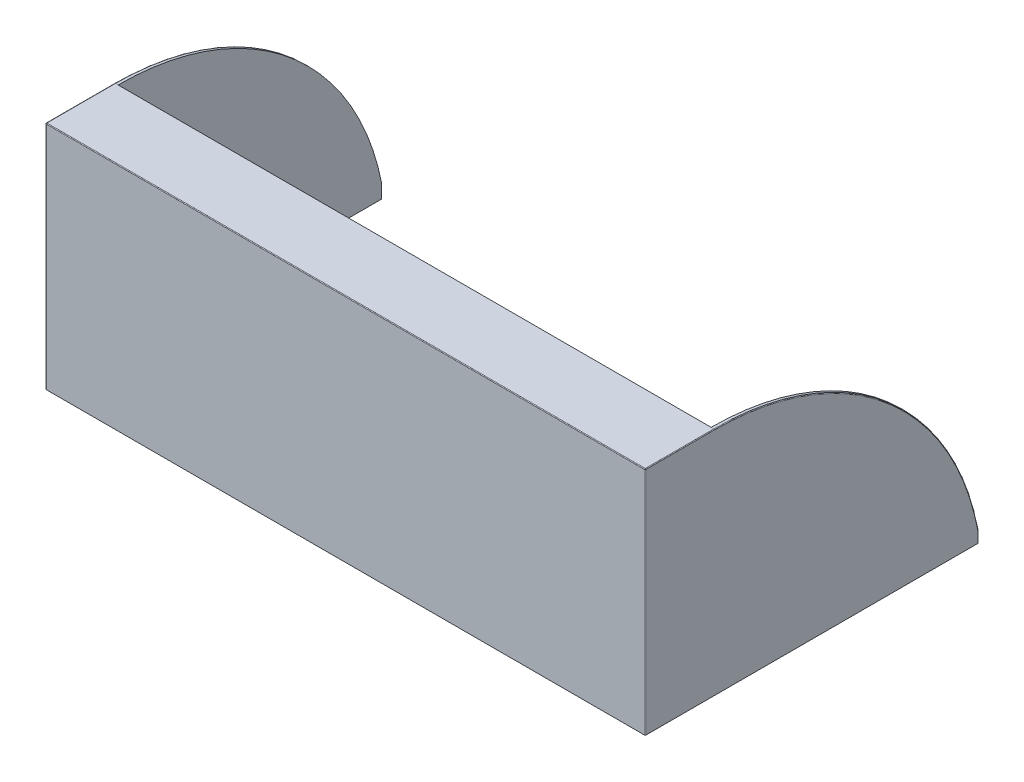
ISO-10303-21;
HEADER;
FILE_DESCRIPTION(('STEP AP214'),'2;1');
FILE_NAME('part.step','',(''),(''),'','','');
FILE_SCHEMA(('AUTOMOTIVE_DESIGN { 1 0 10303 214 1 1 1 1 }'));
ENDSEC;
DATA;
#1=APPLICATION_CONTEXT('core data for automotive mechanical design processes');
#2=APPLICATION_PROTOCOL_DEFINITION('international standard','automotive_design',2000,#1);
#3=PRODUCT_CONTEXT('',#1,'mechanical');
#4=PRODUCT('Part','Part','',(#3));
#5=PRODUCT_RELATED_PRODUCT_CATEGORY('part','',(#4));
#6=PRODUCT_DEFINITION_FORMATION('','',#4);
#7=PRODUCT_DEFINITION_CONTEXT('part definition',#1,'design');
#8=PRODUCT_DEFINITION('design','',#6,#7);
#9=PRODUCT_DEFINITION_SHAPE('','',#8);
#10=(LENGTH_UNIT() NAMED_UNIT(*) SI_UNIT(.MILLI.,.METRE.));
#11=(NAMED_UNIT(*) PLANE_ANGLE_UNIT() SI_UNIT($,.RADIAN.));
#12=(NAMED_UNIT(*) SI_UNIT($,.STERADIAN.) SOLID_ANGLE_UNIT());
#13=UNCERTAINTY_MEASURE_WITH_UNIT(LENGTH_MEASURE(1.E-05),#10,'distance_accuracy_value','');
#14=(GEOMETRIC_REPRESENTATION_CONTEXT(3) GLOBAL_UNCERTAINTY_ASSIGNED_CONTEXT((#13)) GLOBAL_UNIT_ASSIGNED_CONTEXT((#10,
#11,#12)) REPRESENTATION_CONTEXT('',''));
#15=CARTESIAN_POINT('',(0.,0.,0.));
#16=DIRECTION('',(0.,0.,1.));
#17=DIRECTION('',(1.,0.,0.));
#18=AXIS2_PLACEMENT_3D('',#15,#16,#17);
#19=CARTESIAN_POINT('',(-90.,1.,-20.));
#20=DIRECTION('',(0.,0.,-1.));
#21=DIRECTION('',(-1.,0.,0.));
#22=AXIS2_PLACEMENT_3D('',#19,#20,#21);
#23=PLANE('',#22);
#24=DIRECTION('',(1.,0.,0.));
#25=VECTOR('',#24,1.);
#26=CARTESIAN_POINT('',(-90.,0.,-20.));
#27=LINE('',#26,#25);
#28=CARTESIAN_POINT('',(-90.,0.,-20.));
#29=VERTEX_POINT('',#28);
#30=CARTESIAN_POINT('',(90.,0.,-20.));
#31=VERTEX_POINT('',#30);
#32=EDGE_CURVE('E165',#29,#31,#27,.T.);
#33=ORIENTED_EDGE('',*,*,#32,.F.);
#34=DIRECTION('',(0.,-1.,0.));
#35=VECTOR('',#34,1.);
#36=CARTESIAN_POINT('',(-90.,1.,-20.));
#37=LINE('',#36,#35);
#38=CARTESIAN_POINT('',(-90.,1.,-20.));
#39=VERTEX_POINT('',#38);
#40=EDGE_CURVE('E160',#39,#29,#37,.T.);
#41=ORIENTED_EDGE('',*,*,#40,.F.);
#42=DIRECTION('',(1.,0.,0.));
#43=VECTOR('',#42,1.);
#44=CARTESIAN_POINT('',(-90.,1.,-20.));
#45=LINE('',#44,#43);
#46=CARTESIAN_POINT('',(90.,1.,-20.));
#47=VERTEX_POINT('',#46);
#48=EDGE_CURVE('E176',#39,#47,#45,.T.);
#49=ORIENTED_EDGE('',*,*,#48,.T.);
#50=DIRECTION('',(0.,-1.,0.));
#51=VECTOR('',#50,1.);
#52=CARTESIAN_POINT('',(90.,1.,-20.));
#53=LINE('',#52,#51);
#54=EDGE_CURVE('E249',#47,#31,#53,.T.);
#55=ORIENTED_EDGE('',*,*,#54,.T.);
#56=EDGE_LOOP('',(#33,#41,#49,#55));
#57=FACE_BOUND('',#56,.T.);
#58=ADVANCED_FACE('F38',(#57),#23,.T.);
#59=CARTESIAN_POINT('',(0.,1.,0.));
#60=DIRECTION('',(0.,-1.,0.));
#61=DIRECTION('',(0.,0.,-1.));
#62=AXIS2_PLACEMENT_3D('',#59,#60,#61);
#63=PLANE('',#62);
#64=DIRECTION('',(1.,0.,0.));
#65=VECTOR('',#64,1.);
#66=CARTESIAN_POINT('',(-91.,1.,-20.));
#67=LINE('',#66,#65);
#68=CARTESIAN_POINT('',(-90.8,1.,-20.));
#69=VERTEX_POINT('',#68);
#70=EDGE_CURVE('E209',#69,#39,#67,.T.);
#71=ORIENTED_EDGE('',*,*,#70,.F.);
#72=DIRECTION('',(0.,0.,-1.));
#73=VECTOR('',#72,1.);
#74=CARTESIAN_POINT('',(-90.8,1.,1.));
#75=LINE('',#74,#73);
#76=CARTESIAN_POINT('',(-90.8,1.,0.8));
#77=VERTEX_POINT('',#76);
#78=EDGE_CURVE('E11',#69,#77,#75,.F.);
#79=ORIENTED_EDGE('',*,*,#78,.T.);
#80=DIRECTION('',(-1.,0.,0.));
#81=VECTOR('',#80,1.);
#82=CARTESIAN_POINT('',(91.,1.,0.8));
#83=LINE('',#82,#81);
#84=CARTESIAN_POINT('',(90.8,1.,0.8));
#85=VERTEX_POINT('',#84);
#86=EDGE_CURVE('E49',#77,#85,#83,.F.);
#87=ORIENTED_EDGE('',*,*,#86,.T.);
#88=DIRECTION('',(0.,0.,1.));
#89=VECTOR('',#88,1.);
#90=CARTESIAN_POINT('',(90.8,1.,0.));
#91=LINE('',#90,#89);
#92=CARTESIAN_POINT('',(90.8,1.,-20.));
#93=VERTEX_POINT('',#92);
#94=EDGE_CURVE('E337',#85,#93,#91,.F.);
#95=ORIENTED_EDGE('',*,*,#94,.T.);
#96=DIRECTION('',(-1.,0.,0.));
#97=VECTOR('',#96,1.);
#98=CARTESIAN_POINT('',(91.,1.,-20.));
#99=LINE('',#98,#97);
#100=EDGE_CURVE('E221',#93,#47,#99,.T.);
#101=ORIENTED_EDGE('',*,*,#100,.T.);
#102=ORIENTED_EDGE('',*,*,#48,.F.);
#103=EDGE_LOOP('',(#71,#79,#87,#95,#101,#102));
#104=FACE_BOUND('',#103,.T.);
#105=ADVANCED_FACE('F408',(#104),#63,.F.);
#106=CARTESIAN_POINT('',(0.,0.,0.));
#107=DIRECTION('',(0.,-1.,0.));
#108=DIRECTION('',(0.,0.,-1.));
#109=AXIS2_PLACEMENT_3D('',#106,#107,#108);
#110=PLANE('',#109);
#111=DIRECTION('',(0.,0.,-1.));
#112=VECTOR('',#111,1.);
#113=CARTESIAN_POINT('',(-90.,0.,0.));
#114=LINE('',#113,#112);
#115=CARTESIAN_POINT('',(-90.,0.,0.));
#116=VERTEX_POINT('',#115);
#117=EDGE_CURVE('E151',#116,#29,#114,.T.);
#118=ORIENTED_EDGE('',*,*,#117,.T.);
#119=ORIENTED_EDGE('',*,*,#32,.T.);
#120=DIRECTION('',(0.,0.,-1.));
#121=VECTOR('',#120,1.);
#122=CARTESIAN_POINT('',(90.,0.,0.));
#123=LINE('',#122,#121);
#124=CARTESIAN_POINT('',(90.,0.,0.));
#125=VERTEX_POINT('',#124);
#126=EDGE_CURVE('E172',#125,#31,#123,.T.);
#127=ORIENTED_EDGE('',*,*,#126,.F.);
#128=DIRECTION('',(1.,0.,0.));
#129=VECTOR('',#128,1.);
#130=CARTESIAN_POINT('',(-90.,0.,0.));
#131=LINE('',#130,#129);
#132=EDGE_CURVE('E170',#116,#125,#131,.T.);
#133=ORIENTED_EDGE('',*,*,#132,.F.);
#134=EDGE_LOOP('',(#118,#119,#127,#133));
#135=FACE_BOUND('',#134,.T.);
#136=ADVANCED_FACE('F171',(#135),#110,.T.);
#137=CARTESIAN_POINT('',(91.,-69.,0.));
#138=DIRECTION('',(0.,1.,0.));
#139=DIRECTION('',(0.,0.,1.));
#140=AXIS2_PLACEMENT_3D('',#137,#138,#139);
#141=PLANE('',#140);
#142=DIRECTION('',(1.,0.,0.));
#143=VECTOR('',#142,1.);
#144=CARTESIAN_POINT('',(-91.,-69.,1.));
#145=LINE('',#144,#143);
#146=CARTESIAN_POINT('',(-90.8,-69.,1.));
#147=VERTEX_POINT('',#146);
#148=CARTESIAN_POINT('',(90.8,-69.,1.));
#149=VERTEX_POINT('',#148);
#150=EDGE_CURVE('E183',#147,#149,#145,.T.);
#151=ORIENTED_EDGE('',*,*,#150,.F.);
#152=CARTESIAN_POINT('',(-90.8,-69.,0.8));
#153=DIRECTION('',(0.,1.,0.));
#154=DIRECTION('',(0.,0.,1.));
#155=AXIS2_PLACEMENT_3D('',#152,#153,#154);
#156=CIRCLE('',#155,0.2);
#157=CARTESIAN_POINT('',(-91.,-69.,0.8));
#158=VERTEX_POINT('',#157);
#159=EDGE_CURVE('E334',#147,#158,#156,.F.);
#160=ORIENTED_EDGE('',*,*,#159,.T.);
#161=DIRECTION('',(0.,0.,1.));
#162=VECTOR('',#161,1.);
#163=CARTESIAN_POINT('',(-91.,-69.,0.));
#164=LINE('',#163,#162);
#165=CARTESIAN_POINT('',(-91.,-69.,-100.));
#166=VERTEX_POINT('',#165);
#167=EDGE_CURVE('E193',#166,#158,#164,.T.);
#168=ORIENTED_EDGE('',*,*,#167,.F.);
#169=DIRECTION('',(1.,0.,0.));
#170=VECTOR('',#169,1.);
#171=CARTESIAN_POINT('',(-91.,-69.,-100.));
#172=LINE('',#171,#170);
#173=CARTESIAN_POINT('',(-90.,-69.,-100.));
#174=VERTEX_POINT('',#173);
#175=EDGE_CURVE('E202',#166,#174,#172,.T.);
#176=ORIENTED_EDGE('',*,*,#175,.T.);
#177=DIRECTION('',(0.,0.,1.));
#178=VECTOR('',#177,1.);
#179=CARTESIAN_POINT('',(-90.,-69.,0.));
#180=LINE('',#179,#178);
#181=CARTESIAN_POINT('',(-90.,-69.,0.));
#182=VERTEX_POINT('',#181);
#183=EDGE_CURVE('E198',#174,#182,#180,.T.);
#184=ORIENTED_EDGE('',*,*,#183,.T.);
#185=DIRECTION('',(1.,0.,0.));
#186=VECTOR('',#185,1.);
#187=CARTESIAN_POINT('',(-91.,-69.,0.));
#188=LINE('',#187,#186);
#189=CARTESIAN_POINT('',(90.,-69.,0.));
#190=VERTEX_POINT('',#189);
#191=EDGE_CURVE('E180',#182,#190,#188,.T.);
#192=ORIENTED_EDGE('',*,*,#191,.T.);
#193=DIRECTION('',(0.,0.,-1.));
#194=VECTOR('',#193,1.);
#195=CARTESIAN_POINT('',(90.,-69.,0.));
#196=LINE('',#195,#194);
#197=CARTESIAN_POINT('',(90.,-69.,-100.));
#198=VERTEX_POINT('',#197);
#199=EDGE_CURVE('E224',#190,#198,#196,.T.);
#200=ORIENTED_EDGE('',*,*,#199,.T.);
#201=DIRECTION('',(-1.,0.,0.));
#202=VECTOR('',#201,1.);
#203=CARTESIAN_POINT('',(91.,-69.,-100.));
#204=LINE('',#203,#202);
#205=CARTESIAN_POINT('',(91.,-69.,-100.));
#206=VERTEX_POINT('',#205);
#207=EDGE_CURVE('E166',#206,#198,#204,.T.);
#208=ORIENTED_EDGE('',*,*,#207,.F.);
#209=DIRECTION('',(0.,0.,-1.));
#210=VECTOR('',#209,1.);
#211=CARTESIAN_POINT('',(91.,-69.,0.));
#212=LINE('',#211,#210);
#213=CARTESIAN_POINT('',(91.,-69.,0.8));
#214=VERTEX_POINT('',#213);
#215=EDGE_CURVE('E213',#214,#206,#212,.T.);
#216=ORIENTED_EDGE('',*,*,#215,.F.);
#217=CARTESIAN_POINT('',(90.8,-69.,0.8));
#218=DIRECTION('',(0.,1.,0.));
#219=DIRECTION('',(0.,0.,1.));
#220=AXIS2_PLACEMENT_3D('',#217,#218,#219);
#221=CIRCLE('',#220,0.2);
#222=EDGE_CURVE('E331',#214,#149,#221,.F.);
#223=ORIENTED_EDGE('',*,*,#222,.T.);
#224=EDGE_LOOP('',(#151,#160,#168,#176,#184,#192,#200,#208,#216,#223));
#225=FACE_BOUND('',#224,.T.);
#226=ADVANCED_FACE('F308',(#225),#141,.F.);
#227=CARTESIAN_POINT('',(91.,-69.,-100.));
#228=DIRECTION('',(0.,0.,1.));
#229=DIRECTION('',(1.,0.,0.));
#230=AXIS2_PLACEMENT_3D('',#227,#228,#229);
#231=PLANE('',#230);
#232=DIRECTION('',(-1.,0.,0.));
#233=VECTOR('',#232,1.);
#234=CARTESIAN_POINT('',(91.,-64.8928482707894,-100.));
#235=LINE('',#234,#233);
#236=CARTESIAN_POINT('',(90.8,-64.8928482707894,-100.));
#237=VERTEX_POINT('',#236);
#238=CARTESIAN_POINT('',(90.,-64.8928482707894,-100.));
#239=VERTEX_POINT('',#238);
#240=EDGE_CURVE('E236',#237,#239,#235,.T.);
#241=ORIENTED_EDGE('',*,*,#240,.F.);
#242=CARTESIAN_POINT('',(90.8,-64.8928482707894,-100.));
#243=CARTESIAN_POINT('',(90.8023758316902,-64.8928412719718,-100.));
#244=CARTESIAN_POINT('',(90.8047420120212,-64.8930689184265,-100.));
#245=CARTESIAN_POINT('',(90.8093692262902,-64.8939271343331,-100.));
#246=CARTESIAN_POINT('',(90.8116312364357,-64.894552340183,-100.));
#247=CARTESIAN_POINT('',(90.8167041362082,-64.8963860826479,-100.));
#248=CARTESIAN_POINT('',(90.8194707140167,-64.897714687656,-100.));
#249=CARTESIAN_POINT('',(90.8247706944289,-64.9007931890213,-100.));
#250=CARTESIAN_POINT('',(90.8273025952241,-64.9025455701055,-100.));
#251=CARTESIAN_POINT('',(90.8340476416876,-64.9078365333926,-100.));
#252=CARTESIAN_POINT('',(90.8380081819196,-64.9116922866512,-100.));
#253=CARTESIAN_POINT('',(90.8453687527471,-64.9198935921124,-100.));
#254=CARTESIAN_POINT('',(90.848767490103,-64.9242402366777,-100.));
#255=CARTESIAN_POINT('',(90.8570926101521,-64.9359510860998,-100.));
#256=CARTESIAN_POINT('',(90.8616928710426,-64.9435444407459,-100.));
#257=CARTESIAN_POINT('',(90.8701988629481,-64.9591162190174,-100.));
#258=CARTESIAN_POINT('',(90.8741028434772,-64.9670955507947,-100.));
#259=CARTESIAN_POINT('',(90.8851107427775,-64.991444236167,-100.));
#260=CARTESIAN_POINT('',(90.8914649690109,-65.0081491483521,-100.));
#261=CARTESIAN_POINT('',(90.9036892802995,-65.0439693029047,-100.));
#262=CARTESIAN_POINT('',(90.9094090301782,-65.063132645802,-100.));
#263=CARTESIAN_POINT('',(90.9198560633837,-65.1017322429305,-100.));
#264=CARTESIAN_POINT('',(90.9245829677657,-65.1211685983552,-100.));
#265=CARTESIAN_POINT('',(90.9377075484216,-65.1798093014369,-100.));
#266=CARTESIAN_POINT('',(90.9450211075876,-65.2192527477413,-100.));
#267=CARTESIAN_POINT('',(90.9578092355502,-65.2984603361936,-100.));
#268=CARTESIAN_POINT('',(90.9632818986962,-65.3382247672944,-100.));
#269=CARTESIAN_POINT('',(90.9728317101254,-65.4178662047621,-100.));
#270=CARTESIAN_POINT('',(90.9769106781084,-65.4577429952637,-100.));
#271=CARTESIAN_POINT('',(90.983930983144,-65.537354336889,-100.));
#272=CARTESIAN_POINT('',(90.9868789608967,-65.5770883176463,-100.));
#273=CARTESIAN_POINT('',(90.9918287799752,-65.6566329940915,-100.));
#274=CARTESIAN_POINT('',(90.9938301793782,-65.6964437169162,-100.));
#275=CARTESIAN_POINT('',(90.9969684373727,-65.7756752020309,-100.));
#276=CARTESIAN_POINT('',(90.9981142487959,-65.8150956172609,-100.));
#277=CARTESIAN_POINT('',(90.9996273071879,-65.893927740204,-100.));
#278=CARTESIAN_POINT('',(90.9999950239513,-65.9333394387972,-100.));
#279=CARTESIAN_POINT('',(91.,-65.9727501631906,-100.));
#280=B_SPLINE_CURVE_WITH_KNOTS('',3,(#242,#243,#244,#245,#246,#247,#248,#249,#250,#251,#252,
#253,#254,#255,#256,#257,#258,#259,#260,#261,#262,#263,#264,#265,#266,#267,#268,#269,#270,#271,
#272,#273,#274,#275,#276,#277,#278,#279),.UNSPECIFIED.,.F.,.F.,(4,2,2,2,2,2,2,2,2,2,2,2,2,2,2,2,
2,2,4),(0.,0.00710105776747363,0.0141082886157392,0.0232636125460189,0.0324739770362471,
0.0489630291419828,0.0654895249202987,0.092054857370974,0.118686062897145,0.172210123115982,
0.232176691608029,0.292166106455486,0.412434090924712,0.532826193477361,0.653060498087997,
0.772577619811276,0.892150484736433,1.01045390258576,1.12868587130505),.UNSPECIFIED.);
#281=CARTESIAN_POINT('',(91.,-65.9727501631906,-100.));
#282=VERTEX_POINT('',#281);
#283=EDGE_CURVE('E312',#237,#282,#280,.T.);
#284=ORIENTED_EDGE('',*,*,#283,.T.);
#285=DIRECTION('',(0.,1.,0.));
#286=VECTOR('',#285,1.);
#287=CARTESIAN_POINT('',(91.,-69.,-100.));
#288=LINE('',#287,#286);
#289=EDGE_CURVE('E216',#206,#282,#288,.T.);
#290=ORIENTED_EDGE('',*,*,#289,.F.);
#291=ORIENTED_EDGE('',*,*,#207,.T.);
#292=DIRECTION('',(0.,1.,0.));
#293=VECTOR('',#292,1.);
#294=CARTESIAN_POINT('',(90.,-69.,-100.));
#295=LINE('',#294,#293);
#296=EDGE_CURVE('E227',#198,#239,#295,.T.);
#297=ORIENTED_EDGE('',*,*,#296,.T.);
#298=EDGE_LOOP('',(#241,#284,#290,#291,#297));
#299=FACE_BOUND('',#298,.T.);
#300=ADVANCED_FACE('F303',(#299),#231,.F.);
#301=CARTESIAN_POINT('',(91.,-80.5101163110534,-20.));
#302=DIRECTION('',(-1.,0.,0.));
#303=DIRECTION('',(0.,0.,1.));
#304=AXIS2_PLACEMENT_3D('',#301,#302,#303);
#305=CYLINDRICAL_SURFACE('',#304,81.5101163110534);
#306=ORIENTED_EDGE('',*,*,#100,.F.);
#307=CARTESIAN_POINT('',(90.8,-80.5101163110534,-20.));
#308=DIRECTION('',(-1.,0.,0.));
#309=DIRECTION('',(0.,0.,1.));
#310=AXIS2_PLACEMENT_3D('',#307,#308,#309);
#311=CIRCLE('',#310,81.5101163110534);
#312=EDGE_CURVE('E321',#93,#237,#311,.T.);
#313=ORIENTED_EDGE('',*,*,#312,.T.);
#314=ORIENTED_EDGE('',*,*,#240,.T.);
#315=CARTESIAN_POINT('',(90.,-80.5101163110534,-20.));
#316=DIRECTION('',(1.,0.,0.));
#317=DIRECTION('',(0.,0.,1.));
#318=AXIS2_PLACEMENT_3D('',#315,#316,#317);
#319=CIRCLE('',#318,81.5101163110534);
#320=EDGE_CURVE('E217',#239,#47,#319,.T.);
#321=ORIENTED_EDGE('',*,*,#320,.T.);
#322=EDGE_LOOP('',(#306,#313,#314,#321));
#323=FACE_BOUND('',#322,.T.);
#324=ADVANCED_FACE('F296',(#323),#305,.T.);
#325=CARTESIAN_POINT('',(91.,-80.5101163110534,-20.));
#326=DIRECTION('',(-1.,0.,0.));
#327=DIRECTION('',(0.,0.,1.));
#328=AXIS2_PLACEMENT_3D('',#325,#326,#327);
#329=PLANE('',#328);
#330=ORIENTED_EDGE('',*,*,#289,.T.);
#331=CARTESIAN_POINT('',(91.,-80.5101163110534,-20.));
#332=DIRECTION('',(-1.,0.,0.));
#333=DIRECTION('',(0.,0.,1.));
#334=AXIS2_PLACEMENT_3D('',#331,#332,#333);
#335=CIRCLE('',#334,81.3101163110534);
#336=CARTESIAN_POINT('',(91.,0.799999999999995,-20.));
#337=VERTEX_POINT('',#336);
#338=EDGE_CURVE('E421',#282,#337,#335,.F.);
#339=ORIENTED_EDGE('',*,*,#338,.T.);
#340=DIRECTION('',(0.,0.,1.));
#341=VECTOR('',#340,1.);
#342=CARTESIAN_POINT('',(91.,0.799999999999995,-20.));
#343=LINE('',#342,#341);
#344=CARTESIAN_POINT('',(91.,0.799999999999995,0.8));
#345=VERTEX_POINT('',#344);
#346=EDGE_CURVE('E427',#337,#345,#343,.T.);
#347=ORIENTED_EDGE('',*,*,#346,.T.);
#348=DIRECTION('',(0.,1.,0.));
#349=VECTOR('',#348,1.);
#350=CARTESIAN_POINT('',(91.,-69.,0.8));
#351=LINE('',#350,#349);
#352=EDGE_CURVE('E424',#345,#214,#351,.F.);
#353=ORIENTED_EDGE('',*,*,#352,.T.);
#354=ORIENTED_EDGE('',*,*,#215,.T.);
#355=EDGE_LOOP('',(#330,#339,#347,#353,#354));
#356=FACE_BOUND('',#355,.T.);
#357=ADVANCED_FACE('F292',(#356),#329,.F.);
#358=CARTESIAN_POINT('',(90.,-80.5101163110534,-20.));
#359=DIRECTION('',(-1.,0.,0.));
#360=DIRECTION('',(0.,0.,1.));
#361=AXIS2_PLACEMENT_3D('',#358,#359,#360);
#362=PLANE('',#361);
#363=DIRECTION('',(0.,-1.,0.));
#364=VECTOR('',#363,1.);
#365=CARTESIAN_POINT('',(90.,1.,0.));
#366=LINE('',#365,#364);
#367=EDGE_CURVE('E212',#125,#190,#366,.T.);
#368=ORIENTED_EDGE('',*,*,#367,.F.);
#369=ORIENTED_EDGE('',*,*,#126,.T.);
#370=ORIENTED_EDGE('',*,*,#54,.F.);
#371=ORIENTED_EDGE('',*,*,#320,.F.);
#372=ORIENTED_EDGE('',*,*,#296,.F.);
#373=ORIENTED_EDGE('',*,*,#199,.F.);
#374=EDGE_LOOP('',(#368,#369,#370,#371,#372,#373));
#375=FACE_BOUND('',#374,.T.);
#376=ADVANCED_FACE('F295',(#375),#362,.T.);
#377=CARTESIAN_POINT('',(-90.,-80.5101163110534,-20.));
#378=DIRECTION('',(-1.,0.,0.));
#379=DIRECTION('',(0.,0.,1.));
#380=AXIS2_PLACEMENT_3D('',#377,#378,#379);
#381=PLANE('',#380);
#382=ORIENTED_EDGE('',*,*,#117,.F.);
#383=DIRECTION('',(0.,1.,0.));
#384=VECTOR('',#383,1.);
#385=CARTESIAN_POINT('',(-90.,1.,0.));
#386=LINE('',#385,#384);
#387=EDGE_CURVE('E156',#182,#116,#386,.T.);
#388=ORIENTED_EDGE('',*,*,#387,.F.);
#389=ORIENTED_EDGE('',*,*,#183,.F.);
#390=DIRECTION('',(0.,-1.,0.));
#391=VECTOR('',#390,1.);
#392=CARTESIAN_POINT('',(-90.,-69.,-100.));
#393=LINE('',#392,#391);
#394=CARTESIAN_POINT('',(-90.,-64.8928482707894,-100.));
#395=VERTEX_POINT('',#394);
#396=EDGE_CURVE('E188',#395,#174,#393,.T.);
#397=ORIENTED_EDGE('',*,*,#396,.F.);
#398=CARTESIAN_POINT('',(-90.,-80.5101163110534,-20.));
#399=DIRECTION('',(-1.,0.,0.));
#400=DIRECTION('',(0.,0.,1.));
#401=AXIS2_PLACEMENT_3D('',#398,#399,#400);
#402=CIRCLE('',#401,81.5101163110534);
#403=EDGE_CURVE('E182',#39,#395,#402,.T.);
#404=ORIENTED_EDGE('',*,*,#403,.F.);
#405=ORIENTED_EDGE('',*,*,#40,.T.);
#406=EDGE_LOOP('',(#382,#388,#389,#397,#404,#405));
#407=FACE_BOUND('',#406,.T.);
#408=ADVANCED_FACE('F153',(#407),#381,.F.);
#409=CARTESIAN_POINT('',(-91.,-80.5101163110534,-20.));
#410=DIRECTION('',(1.,0.,0.));
#411=DIRECTION('',(0.,0.,-1.));
#412=AXIS2_PLACEMENT_3D('',#409,#410,#411);
#413=CYLINDRICAL_SURFACE('',#412,81.5101163110534);
#414=DIRECTION('',(1.,0.,0.));
#415=VECTOR('',#414,1.);
#416=CARTESIAN_POINT('',(-91.,-64.8928482707894,-100.));
#417=LINE('',#416,#415);
#418=CARTESIAN_POINT('',(-90.8,-64.8928482707894,-100.));
#419=VERTEX_POINT('',#418);
#420=EDGE_CURVE('E206',#419,#395,#417,.T.);
#421=ORIENTED_EDGE('',*,*,#420,.F.);
#422=CARTESIAN_POINT('',(-90.8,-80.5101163110534,-20.));
#423=DIRECTION('',(-1.,0.,0.));
#424=DIRECTION('',(0.,0.,1.));
#425=AXIS2_PLACEMENT_3D('',#422,#423,#424);
#426=CIRCLE('',#425,81.5101163110534);
#427=EDGE_CURVE('E274',#419,#69,#426,.F.);
#428=ORIENTED_EDGE('',*,*,#427,.T.);
#429=ORIENTED_EDGE('',*,*,#70,.T.);
#430=ORIENTED_EDGE('',*,*,#403,.T.);
#431=EDGE_LOOP('',(#421,#428,#429,#430));
#432=FACE_BOUND('',#431,.T.);
#433=ADVANCED_FACE('F286',(#432),#413,.T.);
#434=CARTESIAN_POINT('',(-91.,-69.,-100.));
#435=DIRECTION('',(0.,0.,1.));
#436=DIRECTION('',(1.,0.,0.));
#437=AXIS2_PLACEMENT_3D('',#434,#435,#436);
#438=PLANE('',#437);
#439=DIRECTION('',(0.,-1.,0.));
#440=VECTOR('',#439,1.);
#441=CARTESIAN_POINT('',(-91.,-69.,-100.));
#442=LINE('',#441,#440);
#443=CARTESIAN_POINT('',(-91.,-65.9727501631906,-100.));
#444=VERTEX_POINT('',#443);
#445=EDGE_CURVE('E201',#444,#166,#442,.T.);
#446=ORIENTED_EDGE('',*,*,#445,.F.);
#447=CARTESIAN_POINT('',(-91.,-65.9727501631906,-100.));
#448=CARTESIAN_POINT('',(-90.9999987608847,-65.939401214846,-100.));
#449=CARTESIAN_POINT('',(-90.9997338568929,-65.9060532233295,-100.));
#450=CARTESIAN_POINT('',(-90.9986525960738,-65.8393630875575,-100.));
#451=CARTESIAN_POINT('',(-90.997836186997,-65.8060209441554,-100.));
#452=CARTESIAN_POINT('',(-90.9945225157889,-65.7059864652773,-100.));
#453=CARTESIAN_POINT('',(-90.991160764036,-65.6393183160146,-100.));
#454=CARTESIAN_POINT('',(-90.9836852864639,-65.5345825001477,-100.));
#455=CARTESIAN_POINT('',(-90.9805042866027,-65.4964477103562,-100.));
#456=CARTESIAN_POINT('',(-90.9730515917548,-65.4202893222375,-100.));
#457=CARTESIAN_POINT('',(-90.9687800324271,-65.382265710675,-100.));
#458=CARTESIAN_POINT('',(-90.9570976306579,-65.2925618801717,-100.));
#459=CARTESIAN_POINT('',(-90.9491100477176,-65.2409515517214,-100.));
#460=CARTESIAN_POINT('',(-90.9323495855032,-65.1545971988612,-100.));
#461=CARTESIAN_POINT('',(-90.9246164934108,-65.1196609225324,-100.));
#462=CARTESIAN_POINT('',(-90.9089737821765,-65.0613107462751,-100.));
#463=CARTESIAN_POINT('',(-90.9018654884315,-65.0376893348814,-100.));
#464=CARTESIAN_POINT('',(-90.8877302862457,-64.9983327445115,-100.));
#465=CARTESIAN_POINT('',(-90.8813364107228,-64.9823844518559,-100.));
#466=CARTESIAN_POINT('',(-90.8700380897579,-64.9588427710386,-100.));
#467=CARTESIAN_POINT('',(-90.8658795460307,-64.9508951259465,-100.));
#468=CARTESIAN_POINT('',(-90.8567507353269,-64.9354879317446,-100.));
#469=CARTESIAN_POINT('',(-90.8517836715664,-64.9280266129543,-100.));
#470=CARTESIAN_POINT('',(-90.8438994185254,-64.9182531399275,-100.));
#471=CARTESIAN_POINT('',(-90.8415166936627,-64.915514551391,-100.));
#472=CARTESIAN_POINT('',(-90.8364792263253,-64.9102794657274,-100.));
#473=CARTESIAN_POINT('',(-90.8338237287245,-64.9077836800369,-100.));
#474=CARTESIAN_POINT('',(-90.8281470121975,-64.9031295585127,-100.));
#475=CARTESIAN_POINT('',(-90.825120280394,-64.9009777776305,-100.));
#476=CARTESIAN_POINT('',(-90.818721923562,-64.897299181549,-100.));
#477=CARTESIAN_POINT('',(-90.8153535096287,-64.8957671194732,-100.));
#478=CARTESIAN_POINT('',(-90.8099413941693,-64.8940912126313,-100.));
#479=CARTESIAN_POINT('',(-90.8079950435749,-64.8936329173234,-100.));
#480=CARTESIAN_POINT('',(-90.8040344867139,-64.8930079287126,-100.));
#481=CARTESIAN_POINT('',(-90.8020197662349,-64.8928445387799,-100.));
#482=CARTESIAN_POINT('',(-90.8000000000051,-64.8928482707731,-100.));
#483=B_SPLINE_CURVE_WITH_KNOTS('',3,(#447,#448,#449,#450,#451,#452,#453,#454,#455,#456,#457,
#458,#459,#460,#461,#462,#463,#464,#465,#466,#467,#468,#469,#470,#471,#472,#473,#474,#475,#476,
#477,#478,#479,#480,#481,#482),.UNSPECIFIED.,.F.,.F.,(4,2,2,2,2,2,2,2,2,2,2,2,2,2,2,2,2,4),(0.,
0.100043680888842,0.200096841236956,0.400299822382401,0.515088645571444,0.629863196688221,
0.786439560630167,0.893698382553134,0.967632570116824,1.01907588025381,1.04596324620127,
1.07274657190122,1.08362386484764,1.09453212565787,1.10562832960309,1.1166285150417,
1.12260629414707,1.12865062708297),.UNSPECIFIED.);
#484=EDGE_CURVE('E265',#444,#419,#483,.T.);
#485=ORIENTED_EDGE('',*,*,#484,.T.);
#486=ORIENTED_EDGE('',*,*,#420,.T.);
#487=ORIENTED_EDGE('',*,*,#396,.T.);
#488=ORIENTED_EDGE('',*,*,#175,.F.);
#489=EDGE_LOOP('',(#446,#485,#486,#487,#488));
#490=FACE_BOUND('',#489,.T.);
#491=ADVANCED_FACE('F280',(#490),#438,.F.);
#492=CARTESIAN_POINT('',(-91.,-80.5101163110534,-20.));
#493=DIRECTION('',(-1.,0.,0.));
#494=DIRECTION('',(0.,0.,1.));
#495=AXIS2_PLACEMENT_3D('',#492,#493,#494);
#496=PLANE('',#495);
#497=DIRECTION('',(0.,0.,-1.));
#498=VECTOR('',#497,1.);
#499=CARTESIAN_POINT('',(-91.,0.799999999999995,-20.));
#500=LINE('',#499,#498);
#501=CARTESIAN_POINT('',(-91.,0.799999999999995,0.8));
#502=VERTEX_POINT('',#501);
#503=CARTESIAN_POINT('',(-91.,0.799999999999995,-20.));
#504=VERTEX_POINT('',#503);
#505=EDGE_CURVE('E253',#502,#504,#500,.T.);
#506=ORIENTED_EDGE('',*,*,#505,.T.);
#507=CARTESIAN_POINT('',(-91.,-80.5101163110534,-20.));
#508=DIRECTION('',(-1.,0.,0.));
#509=DIRECTION('',(0.,0.,1.));
#510=AXIS2_PLACEMENT_3D('',#507,#508,#509);
#511=CIRCLE('',#510,81.3101163110534);
#512=EDGE_CURVE('E261',#504,#444,#511,.T.);
#513=ORIENTED_EDGE('',*,*,#512,.T.);
#514=ORIENTED_EDGE('',*,*,#445,.T.);
#515=ORIENTED_EDGE('',*,*,#167,.T.);
#516=DIRECTION('',(0.,-1.,0.));
#517=VECTOR('',#516,1.);
#518=CARTESIAN_POINT('',(-91.,-80.5101163110534,0.799999999999999));
#519=LINE('',#518,#517);
#520=EDGE_CURVE('E258',#158,#502,#519,.F.);
#521=ORIENTED_EDGE('',*,*,#520,.T.);
#522=EDGE_LOOP('',(#506,#513,#514,#515,#521));
#523=FACE_BOUND('',#522,.T.);
#524=ADVANCED_FACE('F285',(#523),#496,.T.);
#525=CARTESIAN_POINT('',(0.,0.,0.));
#526=DIRECTION('',(0.,0.,1.));
#527=DIRECTION('',(1.,0.,0.));
#528=AXIS2_PLACEMENT_3D('',#525,#526,#527);
#529=PLANE('',#528);
#530=ORIENTED_EDGE('',*,*,#132,.T.);
#531=ORIENTED_EDGE('',*,*,#367,.T.);
#532=ORIENTED_EDGE('',*,*,#191,.F.);
#533=ORIENTED_EDGE('',*,*,#387,.T.);
#534=EDGE_LOOP('',(#530,#531,#532,#533));
#535=FACE_BOUND('',#534,.T.);
#536=ADVANCED_FACE('F178',(#535),#529,.F.);
#537=CARTESIAN_POINT('',(0.,0.,1.));
#538=DIRECTION('',(0.,0.,1.));
#539=DIRECTION('',(1.,0.,0.));
#540=AXIS2_PLACEMENT_3D('',#537,#538,#539);
#541=PLANE('',#540);
#542=DIRECTION('',(-1.,0.,0.));
#543=VECTOR('',#542,1.);
#544=CARTESIAN_POINT('',(-91.,0.8,1.));
#545=LINE('',#544,#543);
#546=CARTESIAN_POINT('',(90.8,0.8,1.));
#547=VERTEX_POINT('',#546);
#548=CARTESIAN_POINT('',(-90.8,0.8,1.));
#549=VERTEX_POINT('',#548);
#550=EDGE_CURVE('E320',#547,#549,#545,.T.);
#551=ORIENTED_EDGE('',*,*,#550,.T.);
#552=DIRECTION('',(0.,-1.,0.));
#553=VECTOR('',#552,1.);
#554=CARTESIAN_POINT('',(-90.8,0.,1.));
#555=LINE('',#554,#553);
#556=EDGE_CURVE('E328',#549,#147,#555,.T.);
#557=ORIENTED_EDGE('',*,*,#556,.T.);
#558=ORIENTED_EDGE('',*,*,#150,.T.);
#559=DIRECTION('',(0.,1.,0.));
#560=VECTOR('',#559,1.);
#561=CARTESIAN_POINT('',(90.8,1.,1.));
#562=LINE('',#561,#560);
#563=EDGE_CURVE('E325',#149,#547,#562,.T.);
#564=ORIENTED_EDGE('',*,*,#563,.T.);
#565=EDGE_LOOP('',(#551,#557,#558,#564));
#566=FACE_BOUND('',#565,.T.);
#567=ADVANCED_FACE('F442',(#566),#541,.T.);
#568=CARTESIAN_POINT('',(90.8,-80.5101163110534,-20.));
#569=DIRECTION('',(-1.,0.,0.));
#570=DIRECTION('',(0.,0.,1.));
#571=AXIS2_PLACEMENT_3D('',#568,#569,#570);
#572=TOROIDAL_SURFACE('',#571,81.3101163110534,0.2);
#573=ORIENTED_EDGE('',*,*,#283,.F.);
#574=ORIENTED_EDGE('',*,*,#312,.F.);
#575=CARTESIAN_POINT('',(90.8,0.800000000000001,-20.));
#576=DIRECTION('',(0.,0.,1.));
#577=DIRECTION('',(1.,0.,0.));
#578=AXIS2_PLACEMENT_3D('',#575,#576,#577);
#579=CIRCLE('',#578,0.2);
#580=EDGE_CURVE('E43',#337,#93,#579,.T.);
#581=ORIENTED_EDGE('',*,*,#580,.F.);
#582=ORIENTED_EDGE('',*,*,#338,.F.);
#583=EDGE_LOOP('',(#573,#574,#581,#582));
#584=FACE_BOUND('',#583,.T.);
#585=ADVANCED_FACE('F40',(#584),#572,.T.);
#586=CARTESIAN_POINT('',(90.8,0.799999999999995,-20.));
#587=DIRECTION('',(0.,0.,1.));
#588=DIRECTION('',(1.,0.,0.));
#589=AXIS2_PLACEMENT_3D('',#586,#587,#588);
#590=CYLINDRICAL_SURFACE('',#589,0.2);
#591=ORIENTED_EDGE('',*,*,#580,.T.);
#592=ORIENTED_EDGE('',*,*,#94,.F.);
#593=CARTESIAN_POINT('',(90.8,0.799999999999995,0.8));
#594=DIRECTION('',(0.,0.,1.));
#595=DIRECTION('',(1.,0.,0.));
#596=AXIS2_PLACEMENT_3D('',#593,#594,#595);
#597=CIRCLE('',#596,0.2);
#598=EDGE_CURVE('E365',#345,#85,#597,.T.);
#599=ORIENTED_EDGE('',*,*,#598,.F.);
#600=ORIENTED_EDGE('',*,*,#346,.F.);
#601=EDGE_LOOP('',(#591,#592,#599,#600));
#602=FACE_BOUND('',#601,.T.);
#603=ADVANCED_FACE('F436',(#602),#590,.T.);
#604=CARTESIAN_POINT('',(90.8,0.,0.8));
#605=DIRECTION('',(0.,-1.,0.));
#606=DIRECTION('',(0.,0.,-1.));
#607=AXIS2_PLACEMENT_3D('',#604,#605,#606);
#608=CYLINDRICAL_SURFACE('',#607,0.2);
#609=ORIENTED_EDGE('',*,*,#222,.F.);
#610=ORIENTED_EDGE('',*,*,#352,.F.);
#611=CARTESIAN_POINT('',(90.8,0.8,0.8));
#612=DIRECTION('',(0.,1.,0.));
#613=DIRECTION('',(-1.,0.,0.));
#614=AXIS2_PLACEMENT_3D('',#611,#612,#613);
#615=CIRCLE('',#614,0.2);
#616=EDGE_CURVE('E362',#547,#345,#615,.T.);
#617=ORIENTED_EDGE('',*,*,#616,.F.);
#618=ORIENTED_EDGE('',*,*,#563,.F.);
#619=EDGE_LOOP('',(#609,#610,#617,#618));
#620=FACE_BOUND('',#619,.T.);
#621=ADVANCED_FACE('F434',(#620),#608,.T.);
#622=CARTESIAN_POINT('',(90.8,0.8,0.8));
#623=DIRECTION('',(1.,0.,0.));
#624=DIRECTION('',(0.,1.,0.));
#625=AXIS2_PLACEMENT_3D('',#622,#623,#624);
#626=SPHERICAL_SURFACE('',#625,0.2);
#627=ORIENTED_EDGE('',*,*,#616,.T.);
#628=ORIENTED_EDGE('',*,*,#598,.T.);
#629=CARTESIAN_POINT('',(90.8,0.8,0.8));
#630=DIRECTION('',(1.,0.,0.));
#631=DIRECTION('',(0.,0.,-1.));
#632=AXIS2_PLACEMENT_3D('',#629,#630,#631);
#633=CIRCLE('',#632,0.2);
#634=EDGE_CURVE('E358',#547,#85,#633,.F.);
#635=ORIENTED_EDGE('',*,*,#634,.F.);
#636=EDGE_LOOP('',(#627,#628,#635));
#637=FACE_BOUND('',#636,.T.);
#638=ADVANCED_FACE('F437',(#637),#626,.T.);
#639=CARTESIAN_POINT('',(0.,0.8,0.8));
#640=DIRECTION('',(1.,0.,0.));
#641=DIRECTION('',(0.,0.,-1.));
#642=AXIS2_PLACEMENT_3D('',#639,#640,#641);
#643=CYLINDRICAL_SURFACE('',#642,0.2);
#644=ORIENTED_EDGE('',*,*,#634,.T.);
#645=ORIENTED_EDGE('',*,*,#86,.F.);
#646=CARTESIAN_POINT('',(-90.8,0.8,0.8));
#647=DIRECTION('',(-1.,0.,0.));
#648=DIRECTION('',(0.,0.,1.));
#649=AXIS2_PLACEMENT_3D('',#646,#647,#648);
#650=CIRCLE('',#649,0.2);
#651=EDGE_CURVE('E354',#549,#77,#650,.T.);
#652=ORIENTED_EDGE('',*,*,#651,.F.);
#653=ORIENTED_EDGE('',*,*,#550,.F.);
#654=EDGE_LOOP('',(#644,#645,#652,#653));
#655=FACE_BOUND('',#654,.T.);
#656=ADVANCED_FACE('F440',(#655),#643,.T.);
#657=CARTESIAN_POINT('',(-90.8,0.,0.8));
#658=DIRECTION('',(0.,-1.,0.));
#659=DIRECTION('',(0.,0.,-1.));
#660=AXIS2_PLACEMENT_3D('',#657,#658,#659);
#661=CYLINDRICAL_SURFACE('',#660,0.2);
#662=ORIENTED_EDGE('',*,*,#159,.F.);
#663=ORIENTED_EDGE('',*,*,#556,.F.);
#664=CARTESIAN_POINT('',(-90.8,0.799999999999995,0.8));
#665=DIRECTION('',(0.,1.,0.));
#666=DIRECTION('',(0.,0.,1.));
#667=AXIS2_PLACEMENT_3D('',#664,#665,#666);
#668=CIRCLE('',#667,0.2);
#669=EDGE_CURVE('E350',#502,#549,#668,.T.);
#670=ORIENTED_EDGE('',*,*,#669,.F.);
#671=ORIENTED_EDGE('',*,*,#520,.F.);
#672=EDGE_LOOP('',(#662,#663,#670,#671));
#673=FACE_BOUND('',#672,.T.);
#674=ADVANCED_FACE('F390',(#673),#661,.T.);
#675=CARTESIAN_POINT('',(-90.8,0.8,0.8));
#676=DIRECTION('',(0.,0.,1.));
#677=DIRECTION('',(1.,0.,0.));
#678=AXIS2_PLACEMENT_3D('',#675,#676,#677);
#679=SPHERICAL_SURFACE('',#678,0.2);
#680=ORIENTED_EDGE('',*,*,#669,.T.);
#681=ORIENTED_EDGE('',*,*,#651,.T.);
#682=CARTESIAN_POINT('',(-90.8,0.8,0.8));
#683=DIRECTION('',(0.,0.,1.));
#684=DIRECTION('',(1.,0.,0.));
#685=AXIS2_PLACEMENT_3D('',#682,#683,#684);
#686=CIRCLE('',#685,0.2);
#687=EDGE_CURVE('E346',#502,#77,#686,.F.);
#688=ORIENTED_EDGE('',*,*,#687,.F.);
#689=EDGE_LOOP('',(#680,#681,#688));
#690=FACE_BOUND('',#689,.T.);
#691=ADVANCED_FACE('F396',(#690),#679,.T.);
#692=CARTESIAN_POINT('',(-90.8,0.799999999999995,-20.));
#693=DIRECTION('',(0.,0.,1.));
#694=DIRECTION('',(1.,0.,0.));
#695=AXIS2_PLACEMENT_3D('',#692,#693,#694);
#696=CYLINDRICAL_SURFACE('',#695,0.2);
#697=ORIENTED_EDGE('',*,*,#687,.T.);
#698=ORIENTED_EDGE('',*,*,#78,.F.);
#699=CARTESIAN_POINT('',(-90.8,0.799999999999995,-20.));
#700=DIRECTION('',(0.,0.,-1.));
#701=DIRECTION('',(-1.,0.,0.));
#702=AXIS2_PLACEMENT_3D('',#699,#700,#701);
#703=CIRCLE('',#702,0.2);
#704=EDGE_CURVE('E342',#504,#69,#703,.T.);
#705=ORIENTED_EDGE('',*,*,#704,.F.);
#706=ORIENTED_EDGE('',*,*,#505,.F.);
#707=EDGE_LOOP('',(#697,#698,#705,#706));
#708=FACE_BOUND('',#707,.T.);
#709=ADVANCED_FACE('F399',(#708),#696,.T.);
#710=CARTESIAN_POINT('',(-90.8,-80.5101163110534,-20.));
#711=DIRECTION('',(-1.,0.,0.));
#712=DIRECTION('',(0.,0.,1.));
#713=AXIS2_PLACEMENT_3D('',#710,#711,#712);
#714=TOROIDAL_SURFACE('',#713,81.3101163110534,0.2);
#715=ORIENTED_EDGE('',*,*,#704,.T.);
#716=ORIENTED_EDGE('',*,*,#427,.F.);
#717=ORIENTED_EDGE('',*,*,#484,.F.);
#718=ORIENTED_EDGE('',*,*,#512,.F.);
#719=EDGE_LOOP('',(#715,#716,#717,#718));
#720=FACE_BOUND('',#719,.T.);
#721=ADVANCED_FACE('F276',(#720),#714,.T.);
#722=CLOSED_SHELL('',(#58,#105,#136,#226,#300,#324,#357,#376,#408,#433,#491,#524,#536,#567,#585,
#603,#621,#638,#656,#674,#691,#709,#721));
#723=MANIFOLD_SOLID_BREP('B2',#722);
#724=ADVANCED_BREP_SHAPE_REPRESENTATION('',(#18,#723),#14);
#725=SHAPE_DEFINITION_REPRESENTATION(#9,#724);
ENDSEC;
END-ISO-10303-21;
